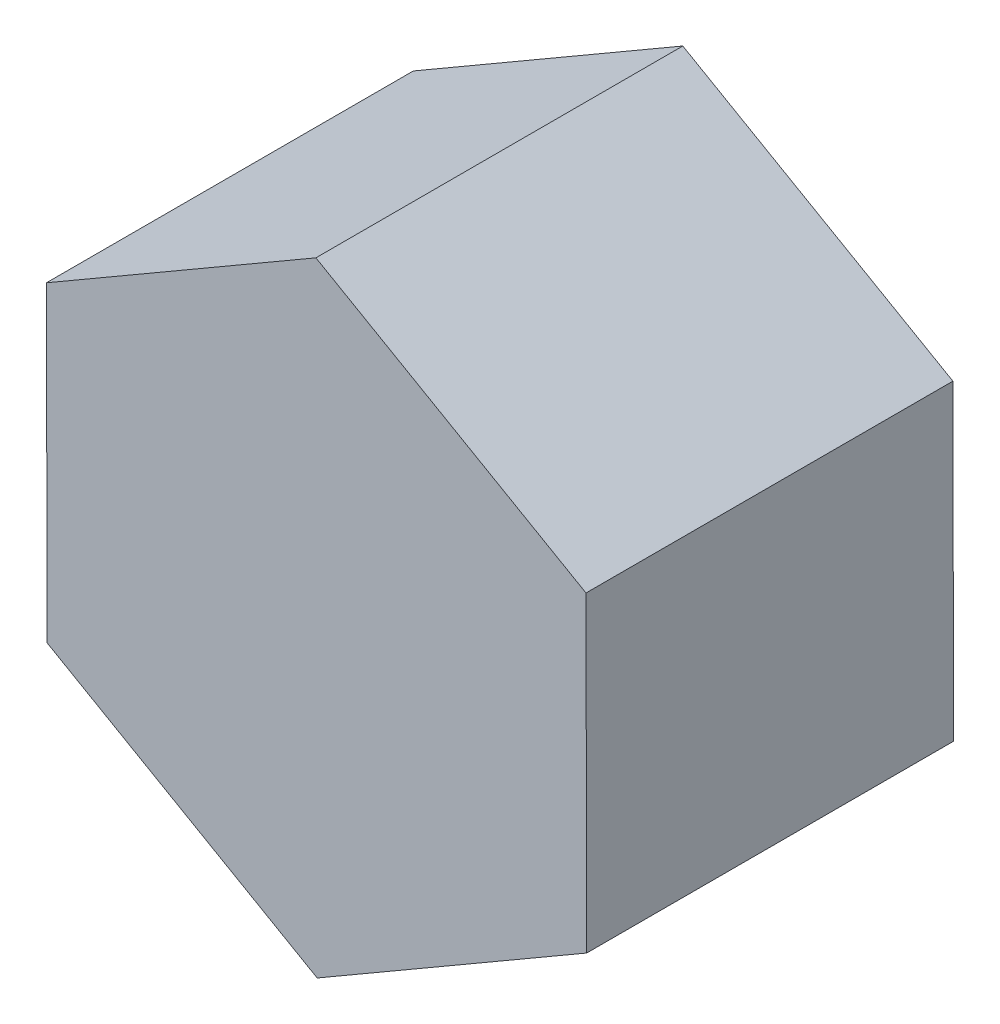
ISO-10303-21;
HEADER;
FILE_DESCRIPTION(('STEP AP214'),'2;1');
FILE_NAME('part.step','',(''),(''),'','','');
FILE_SCHEMA(('AUTOMOTIVE_DESIGN { 1 0 10303 214 1 1 1 1 }'));
ENDSEC;
DATA;
#1=APPLICATION_CONTEXT('core data for automotive mechanical design processes');
#2=APPLICATION_PROTOCOL_DEFINITION('international standard','automotive_design',2000,#1);
#3=PRODUCT_CONTEXT('',#1,'mechanical');
#4=PRODUCT('Part','Part','',(#3));
#5=PRODUCT_RELATED_PRODUCT_CATEGORY('part','',(#4));
#6=PRODUCT_DEFINITION_FORMATION('','',#4);
#7=PRODUCT_DEFINITION_CONTEXT('part definition',#1,'design');
#8=PRODUCT_DEFINITION('design','',#6,#7);
#9=PRODUCT_DEFINITION_SHAPE('','',#8);
#10=(LENGTH_UNIT() NAMED_UNIT(*) SI_UNIT(.MILLI.,.METRE.));
#11=(NAMED_UNIT(*) PLANE_ANGLE_UNIT() SI_UNIT($,.RADIAN.));
#12=(NAMED_UNIT(*) SI_UNIT($,.STERADIAN.) SOLID_ANGLE_UNIT());
#13=UNCERTAINTY_MEASURE_WITH_UNIT(LENGTH_MEASURE(1.E-05),#10,'distance_accuracy_value','');
#14=(GEOMETRIC_REPRESENTATION_CONTEXT(3) GLOBAL_UNCERTAINTY_ASSIGNED_CONTEXT((#13)) GLOBAL_UNIT_ASSIGNED_CONTEXT((#10,
#11,#12)) REPRESENTATION_CONTEXT('',''));
#15=CARTESIAN_POINT('',(0.,0.,0.));
#16=DIRECTION('',(0.,0.,1.));
#17=DIRECTION('',(1.,0.,0.));
#18=AXIS2_PLACEMENT_3D('',#15,#16,#17);
#19=CARTESIAN_POINT('',(0.0154032780043113,-7.33233223963294,8.636));
#20=DIRECTION('',(-0.501818181536703,0.864973128298906,0.));
#21=DIRECTION('',(-0.864973128298907,-0.501818181536703,0.));
#22=AXIS2_PLACEMENT_3D('',#19,#20,#21);
#23=PLANE('',#22);
#24=DIRECTION('',(0.864973128298906,0.501818181536703,0.));
#25=VECTOR('',#24,1.);
#26=CARTESIAN_POINT('',(0.0154032780043113,-7.33233223963294,0.));
#27=LINE('',#26,#25);
#28=CARTESIAN_POINT('',(0.0154032780043113,-7.33233223963294,0.));
#29=VERTEX_POINT('',#28);
#30=CARTESIAN_POINT('',(6.35768762751188,-3.65282648976327,0.));
#31=VERTEX_POINT('',#30);
#32=EDGE_CURVE('E116',#29,#31,#27,.T.);
#33=ORIENTED_EDGE('',*,*,#32,.T.);
#34=DIRECTION('',(0.,0.,-1.));
#35=VECTOR('',#34,1.);
#36=CARTESIAN_POINT('',(6.35768762751188,-3.65282648976327,8.636));
#37=LINE('',#36,#35);
#38=CARTESIAN_POINT('',(6.35768762751188,-3.65282648976327,8.636));
#39=VERTEX_POINT('',#38);
#40=EDGE_CURVE('E11',#39,#31,#37,.T.);
#41=ORIENTED_EDGE('',*,*,#40,.F.);
#42=DIRECTION('',(0.864973128298906,0.501818181536703,0.));
#43=VECTOR('',#42,1.);
#44=CARTESIAN_POINT('',(0.0154032780043113,-7.33233223963294,8.636));
#45=LINE('',#44,#43);
#46=CARTESIAN_POINT('',(0.0154032780043113,-7.33233223963294,8.636));
#47=VERTEX_POINT('',#46);
#48=EDGE_CURVE('E126',#47,#39,#45,.T.);
#49=ORIENTED_EDGE('',*,*,#48,.F.);
#50=DIRECTION('',(0.,0.,-1.));
#51=VECTOR('',#50,1.);
#52=CARTESIAN_POINT('',(0.0154032780043113,-7.33233223963294,8.636));
#53=LINE('',#52,#51);
#54=EDGE_CURVE('E112',#47,#29,#53,.T.);
#55=ORIENTED_EDGE('',*,*,#54,.T.);
#56=EDGE_LOOP('',(#33,#41,#49,#55));
#57=FACE_BOUND('',#56,.T.);
#58=ADVANCED_FACE('F32',(#57),#23,.F.);
#59=CARTESIAN_POINT('',(6.35768762751188,-3.65282648976327,8.636));
#60=DIRECTION('',(-0.999997793466101,-0.00210072914224242,0.));
#61=DIRECTION('',(0.00210072914224242,-0.999997793466101,0.));
#62=AXIS2_PLACEMENT_3D('',#59,#60,#61);
#63=PLANE('',#62);
#64=DIRECTION('',(-0.00210072914224242,0.999997793466101,0.));
#65=VECTOR('',#64,1.);
#66=CARTESIAN_POINT('',(6.35768762751188,-3.65282648976327,0.));
#67=LINE('',#66,#65);
#68=CARTESIAN_POINT('',(6.34228434950762,3.6795057498697,0.));
#69=VERTEX_POINT('',#68);
#70=EDGE_CURVE('E119',#31,#69,#67,.T.);
#71=ORIENTED_EDGE('',*,*,#70,.T.);
#72=DIRECTION('',(0.,0.,-1.));
#73=VECTOR('',#72,1.);
#74=CARTESIAN_POINT('',(6.34228434950762,3.6795057498697,8.636));
#75=LINE('',#74,#73);
#76=CARTESIAN_POINT('',(6.34228434950762,3.6795057498697,8.636));
#77=VERTEX_POINT('',#76);
#78=EDGE_CURVE('E40',#77,#69,#75,.T.);
#79=ORIENTED_EDGE('',*,*,#78,.F.);
#80=DIRECTION('',(-0.00210072914224242,0.999997793466101,0.));
#81=VECTOR('',#80,1.);
#82=CARTESIAN_POINT('',(6.35768762751188,-3.65282648976327,8.636));
#83=LINE('',#82,#81);
#84=EDGE_CURVE('E85',#39,#77,#83,.T.);
#85=ORIENTED_EDGE('',*,*,#84,.F.);
#86=ORIENTED_EDGE('',*,*,#40,.T.);
#87=EDGE_LOOP('',(#71,#79,#85,#86));
#88=FACE_BOUND('',#87,.T.);
#89=ADVANCED_FACE('F150',(#88),#63,.F.);
#90=CARTESIAN_POINT('',(6.34228434950762,3.6795057498697,8.636));
#91=DIRECTION('',(-0.498179611929398,-0.867073857441149,0.));
#92=DIRECTION('',(0.867073857441149,-0.498179611929398,0.));
#93=AXIS2_PLACEMENT_3D('',#90,#91,#92);
#94=PLANE('',#93);
#95=DIRECTION('',(-0.867073857441149,0.498179611929398,0.));
#96=VECTOR('',#95,1.);
#97=CARTESIAN_POINT('',(6.34228434950762,3.6795057498697,0.));
#98=LINE('',#97,#96);
#99=CARTESIAN_POINT('',(-0.0154032780042429,7.33233223963291,0.));
#100=VERTEX_POINT('',#99);
#101=EDGE_CURVE('E121',#69,#100,#98,.T.);
#102=ORIENTED_EDGE('',*,*,#101,.T.);
#103=DIRECTION('',(0.,0.,-1.));
#104=VECTOR('',#103,1.);
#105=CARTESIAN_POINT('',(-0.0154032780042429,7.33233223963291,8.636));
#106=LINE('',#105,#104);
#107=CARTESIAN_POINT('',(-0.0154032780042429,7.33233223963291,8.636));
#108=VERTEX_POINT('',#107);
#109=EDGE_CURVE('E107',#108,#100,#106,.T.);
#110=ORIENTED_EDGE('',*,*,#109,.F.);
#111=DIRECTION('',(-0.867073857441149,0.498179611929398,0.));
#112=VECTOR('',#111,1.);
#113=CARTESIAN_POINT('',(6.34228434950762,3.6795057498697,8.636));
#114=LINE('',#113,#112);
#115=EDGE_CURVE('E98',#77,#108,#114,.T.);
#116=ORIENTED_EDGE('',*,*,#115,.F.);
#117=ORIENTED_EDGE('',*,*,#78,.T.);
#118=EDGE_LOOP('',(#102,#110,#116,#117));
#119=FACE_BOUND('',#118,.T.);
#120=ADVANCED_FACE('F132',(#119),#94,.F.);
#121=CARTESIAN_POINT('',(-0.0154032780042429,7.33233223963291,8.636));
#122=DIRECTION('',(0.501818181536703,-0.864973128298906,0.));
#123=DIRECTION('',(0.864973128298907,0.501818181536703,0.));
#124=AXIS2_PLACEMENT_3D('',#121,#122,#123);
#125=PLANE('',#124);
#126=DIRECTION('',(-0.864973128298907,-0.501818181536703,0.));
#127=VECTOR('',#126,1.);
#128=CARTESIAN_POINT('',(-0.0154032780042429,7.33233223963291,0.));
#129=LINE('',#128,#127);
#130=CARTESIAN_POINT('',(-6.35768762751185,3.65282648976322,0.));
#131=VERTEX_POINT('',#130);
#132=EDGE_CURVE('E106',#100,#131,#129,.T.);
#133=ORIENTED_EDGE('',*,*,#132,.T.);
#134=DIRECTION('',(0.,0.,-1.));
#135=VECTOR('',#134,1.);
#136=CARTESIAN_POINT('',(-6.35768762751185,3.65282648976322,8.636));
#137=LINE('',#136,#135);
#138=CARTESIAN_POINT('',(-6.35768762751185,3.65282648976322,8.636));
#139=VERTEX_POINT('',#138);
#140=EDGE_CURVE('E103',#139,#131,#137,.T.);
#141=ORIENTED_EDGE('',*,*,#140,.F.);
#142=DIRECTION('',(-0.864973128298907,-0.501818181536703,0.));
#143=VECTOR('',#142,1.);
#144=CARTESIAN_POINT('',(-0.0154032780042429,7.33233223963291,8.636));
#145=LINE('',#144,#143);
#146=EDGE_CURVE('E92',#108,#139,#145,.T.);
#147=ORIENTED_EDGE('',*,*,#146,.F.);
#148=ORIENTED_EDGE('',*,*,#109,.T.);
#149=EDGE_LOOP('',(#133,#141,#147,#148));
#150=FACE_BOUND('',#149,.T.);
#151=ADVANCED_FACE('F104',(#150),#125,.F.);
#152=CARTESIAN_POINT('',(-6.35768762751185,3.65282648976322,8.636));
#153=DIRECTION('',(0.999997793466101,0.00210072914224243,0.));
#154=DIRECTION('',(-0.00210072914224243,0.999997793466101,0.));
#155=AXIS2_PLACEMENT_3D('',#152,#153,#154);
#156=PLANE('',#155);
#157=DIRECTION('',(0.00210072914224243,-0.999997793466101,0.));
#158=VECTOR('',#157,1.);
#159=CARTESIAN_POINT('',(-6.35768762751185,3.65282648976322,0.));
#160=LINE('',#159,#158);
#161=CARTESIAN_POINT('',(-6.34228434950759,-3.67950574986969,0.));
#162=VERTEX_POINT('',#161);
#163=EDGE_CURVE('E71',#131,#162,#160,.T.);
#164=ORIENTED_EDGE('',*,*,#163,.T.);
#165=DIRECTION('',(0.,0.,-1.));
#166=VECTOR('',#165,1.);
#167=CARTESIAN_POINT('',(-6.34228434950759,-3.67950574986969,8.636));
#168=LINE('',#167,#166);
#169=CARTESIAN_POINT('',(-6.34228434950759,-3.67950574986969,8.636));
#170=VERTEX_POINT('',#169);
#171=EDGE_CURVE('E108',#170,#162,#168,.T.);
#172=ORIENTED_EDGE('',*,*,#171,.F.);
#173=DIRECTION('',(0.00210072914224243,-0.999997793466101,0.));
#174=VECTOR('',#173,1.);
#175=CARTESIAN_POINT('',(-6.35768762751185,3.65282648976322,8.636));
#176=LINE('',#175,#174);
#177=EDGE_CURVE('E96',#139,#170,#176,.T.);
#178=ORIENTED_EDGE('',*,*,#177,.F.);
#179=ORIENTED_EDGE('',*,*,#140,.T.);
#180=EDGE_LOOP('',(#164,#172,#178,#179));
#181=FACE_BOUND('',#180,.T.);
#182=ADVANCED_FACE('F110',(#181),#156,.F.);
#183=CARTESIAN_POINT('',(-6.34228434950759,-3.67950574986969,8.636));
#184=DIRECTION('',(0.498179611929399,0.867073857441148,0.));
#185=DIRECTION('',(-0.867073857441149,0.498179611929399,0.));
#186=AXIS2_PLACEMENT_3D('',#183,#184,#185);
#187=PLANE('',#186);
#188=DIRECTION('',(0.867073857441149,-0.498179611929399,0.));
#189=VECTOR('',#188,1.);
#190=CARTESIAN_POINT('',(-6.34228434950759,-3.67950574986969,0.));
#191=LINE('',#190,#189);
#192=EDGE_CURVE('E77',#162,#29,#191,.T.);
#193=ORIENTED_EDGE('',*,*,#192,.T.);
#194=ORIENTED_EDGE('',*,*,#54,.F.);
#195=DIRECTION('',(0.867073857441149,-0.498179611929399,0.));
#196=VECTOR('',#195,1.);
#197=CARTESIAN_POINT('',(-6.34228434950759,-3.67950574986969,8.636));
#198=LINE('',#197,#196);
#199=EDGE_CURVE('E48',#170,#47,#198,.T.);
#200=ORIENTED_EDGE('',*,*,#199,.F.);
#201=ORIENTED_EDGE('',*,*,#171,.T.);
#202=EDGE_LOOP('',(#193,#194,#200,#201));
#203=FACE_BOUND('',#202,.T.);
#204=ADVANCED_FACE('F139',(#203),#187,.F.);
#205=CARTESIAN_POINT('',(0.,0.,8.636));
#206=DIRECTION('',(0.,0.,1.));
#207=DIRECTION('',(1.,0.,0.));
#208=AXIS2_PLACEMENT_3D('',#205,#206,#207);
#209=PLANE('',#208);
#210=ORIENTED_EDGE('',*,*,#48,.T.);
#211=ORIENTED_EDGE('',*,*,#84,.T.);
#212=ORIENTED_EDGE('',*,*,#115,.T.);
#213=ORIENTED_EDGE('',*,*,#146,.T.);
#214=ORIENTED_EDGE('',*,*,#177,.T.);
#215=ORIENTED_EDGE('',*,*,#199,.T.);
#216=EDGE_LOOP('',(#210,#211,#212,#213,#214,#215));
#217=FACE_BOUND('',#216,.T.);
#218=ADVANCED_FACE('F94',(#217),#209,.T.);
#219=CARTESIAN_POINT('',(0.,0.,0.));
#220=DIRECTION('',(0.,0.,1.));
#221=DIRECTION('',(1.,0.,0.));
#222=AXIS2_PLACEMENT_3D('',#219,#220,#221);
#223=PLANE('',#222);
#224=ORIENTED_EDGE('',*,*,#32,.F.);
#225=ORIENTED_EDGE('',*,*,#192,.F.);
#226=ORIENTED_EDGE('',*,*,#163,.F.);
#227=ORIENTED_EDGE('',*,*,#132,.F.);
#228=ORIENTED_EDGE('',*,*,#101,.F.);
#229=ORIENTED_EDGE('',*,*,#70,.F.);
#230=EDGE_LOOP('',(#224,#225,#226,#227,#228,#229));
#231=FACE_BOUND('',#230,.T.);
#232=ADVANCED_FACE('F135',(#231),#223,.F.);
#233=CLOSED_SHELL('',(#58,#89,#120,#151,#182,#204,#218,#232));
#234=MANIFOLD_SOLID_BREP('B2',#233);
#235=ADVANCED_BREP_SHAPE_REPRESENTATION('',(#18,#234),#14);
#236=SHAPE_DEFINITION_REPRESENTATION(#9,#235);
ENDSEC;
END-ISO-10303-21;
